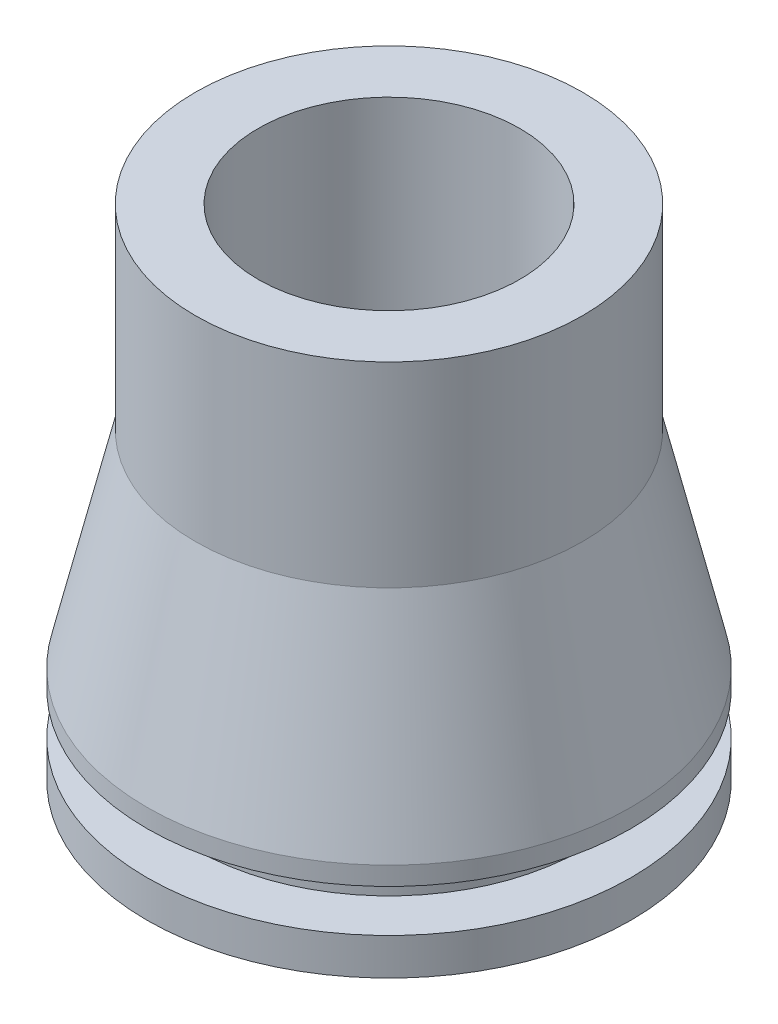
ISO-10303-21;
HEADER;
FILE_DESCRIPTION(('STEP AP214'),'2;1');
FILE_NAME('part.step','',(''),(''),'','','');
FILE_SCHEMA(('AUTOMOTIVE_DESIGN { 1 0 10303 214 1 1 1 1 }'));
ENDSEC;
DATA;
#1=APPLICATION_CONTEXT('core data for automotive mechanical design processes');
#2=APPLICATION_PROTOCOL_DEFINITION('international standard','automotive_design',2000,#1);
#3=PRODUCT_CONTEXT('',#1,'mechanical');
#4=PRODUCT('Part','Part','',(#3));
#5=PRODUCT_RELATED_PRODUCT_CATEGORY('part','',(#4));
#6=PRODUCT_DEFINITION_FORMATION('','',#4);
#7=PRODUCT_DEFINITION_CONTEXT('part definition',#1,'design');
#8=PRODUCT_DEFINITION('design','',#6,#7);
#9=PRODUCT_DEFINITION_SHAPE('','',#8);
#10=(LENGTH_UNIT() NAMED_UNIT(*) SI_UNIT(.MILLI.,.METRE.));
#11=(NAMED_UNIT(*) PLANE_ANGLE_UNIT() SI_UNIT($,.RADIAN.));
#12=(NAMED_UNIT(*) SI_UNIT($,.STERADIAN.) SOLID_ANGLE_UNIT());
#13=UNCERTAINTY_MEASURE_WITH_UNIT(LENGTH_MEASURE(1.E-05),#10,'distance_accuracy_value','');
#14=(GEOMETRIC_REPRESENTATION_CONTEXT(3) GLOBAL_UNCERTAINTY_ASSIGNED_CONTEXT((#13)) GLOBAL_UNIT_ASSIGNED_CONTEXT((#10,
#11,#12)) REPRESENTATION_CONTEXT('',''));
#15=CARTESIAN_POINT('',(0.,0.,0.));
#16=DIRECTION('',(0.,0.,1.));
#17=DIRECTION('',(1.,0.,0.));
#18=AXIS2_PLACEMENT_3D('',#15,#16,#17);
#19=CARTESIAN_POINT('',(6.66115,0.,0.));
#20=DIRECTION('',(0.,-1.,0.));
#21=DIRECTION('',(0.,0.,-1.));
#22=AXIS2_PLACEMENT_3D('',#19,#20,#21);
#23=PLANE('',#22);
#24=CARTESIAN_POINT('',(0.,0.,0.));
#25=DIRECTION('',(0.,-1.,0.));
#26=DIRECTION('',(0.,0.,-1.));
#27=AXIS2_PLACEMENT_3D('',#24,#25,#26);
#28=CIRCLE('',#27,6.66115);
#29=CARTESIAN_POINT('',(0.,0.,-6.66115));
#30=VERTEX_POINT('',#29);
#31=EDGE_CURVE('E64',#30,#30,#28,.T.);
#32=ORIENTED_EDGE('',*,*,#31,.T.);
#33=EDGE_LOOP('',(#32));
#34=FACE_BOUND('',#33,.T.);
#35=CARTESIAN_POINT('',(0.,0.,0.));
#36=DIRECTION('',(0.,-1.,0.));
#37=DIRECTION('',(0.,0.,-1.));
#38=AXIS2_PLACEMENT_3D('',#35,#36,#37);
#39=CIRCLE('',#38,3.60045);
#40=CARTESIAN_POINT('',(0.,0.,-3.60045));
#41=VERTEX_POINT('',#40);
#42=EDGE_CURVE('E10',#41,#41,#39,.T.);
#43=ORIENTED_EDGE('',*,*,#42,.F.);
#44=EDGE_LOOP('',(#43));
#45=FACE_BOUND('',#44,.T.);
#46=ADVANCED_FACE('F30',(#34,#45),#23,.T.);
#47=CARTESIAN_POINT('',(0.,0.,0.));
#48=DIRECTION('',(0.,-1.,0.));
#49=DIRECTION('',(0.,0.,-1.));
#50=AXIS2_PLACEMENT_3D('',#47,#48,#49);
#51=CYLINDRICAL_SURFACE('',#50,3.60045);
#52=ORIENTED_EDGE('',*,*,#42,.T.);
#53=EDGE_LOOP('',(#52));
#54=FACE_BOUND('',#53,.T.);
#55=CARTESIAN_POINT('',(0.,13.7414,0.));
#56=DIRECTION('',(0.,-1.,0.));
#57=DIRECTION('',(0.,0.,-1.));
#58=AXIS2_PLACEMENT_3D('',#55,#56,#57);
#59=CIRCLE('',#58,3.60045);
#60=CARTESIAN_POINT('',(0.,13.7414,-3.60045));
#61=VERTEX_POINT('',#60);
#62=EDGE_CURVE('E36',#61,#61,#59,.T.);
#63=ORIENTED_EDGE('',*,*,#62,.F.);
#64=EDGE_LOOP('',(#63));
#65=FACE_BOUND('',#64,.T.);
#66=ADVANCED_FACE('F82',(#54,#65),#51,.F.);
#67=CARTESIAN_POINT('',(3.60045,13.7414,0.));
#68=DIRECTION('',(0.,1.,0.));
#69=DIRECTION('',(0.,0.,1.));
#70=AXIS2_PLACEMENT_3D('',#67,#68,#69);
#71=PLANE('',#70);
#72=ORIENTED_EDGE('',*,*,#62,.T.);
#73=EDGE_LOOP('',(#72));
#74=FACE_BOUND('',#73,.T.);
#75=CARTESIAN_POINT('',(0.,13.7414,0.));
#76=DIRECTION('',(0.,-1.,0.));
#77=DIRECTION('',(0.,0.,-1.));
#78=AXIS2_PLACEMENT_3D('',#75,#76,#77);
#79=CIRCLE('',#78,5.32765);
#80=CARTESIAN_POINT('',(0.,13.7414,-5.32765));
#81=VERTEX_POINT('',#80);
#82=EDGE_CURVE('E40',#81,#81,#79,.T.);
#83=ORIENTED_EDGE('',*,*,#82,.F.);
#84=EDGE_LOOP('',(#83));
#85=FACE_BOUND('',#84,.T.);
#86=ADVANCED_FACE('F86',(#74,#85),#71,.T.);
#87=CARTESIAN_POINT('',(0.,0.,0.));
#88=DIRECTION('',(0.,-1.,0.));
#89=DIRECTION('',(0.,0.,-1.));
#90=AXIS2_PLACEMENT_3D('',#87,#88,#89);
#91=CYLINDRICAL_SURFACE('',#90,5.32765);
#92=ORIENTED_EDGE('',*,*,#82,.T.);
#93=EDGE_LOOP('',(#92));
#94=FACE_BOUND('',#93,.T.);
#95=CARTESIAN_POINT('',(0.,8.3566,0.));
#96=DIRECTION('',(0.,-1.,0.));
#97=DIRECTION('',(0.,0.,-1.));
#98=AXIS2_PLACEMENT_3D('',#95,#96,#97);
#99=CIRCLE('',#98,5.32765);
#100=CARTESIAN_POINT('',(0.,8.3566,-5.32765));
#101=VERTEX_POINT('',#100);
#102=EDGE_CURVE('E44',#101,#101,#99,.T.);
#103=ORIENTED_EDGE('',*,*,#102,.F.);
#104=EDGE_LOOP('',(#103));
#105=FACE_BOUND('',#104,.T.);
#106=ADVANCED_FACE('F90',(#94,#105),#91,.T.);
#107=CARTESIAN_POINT('',(0.,2.6924,0.));
#108=DIRECTION('',(0.,-1.,0.));
#109=DIRECTION('',(0.,0.,-1.));
#110=AXIS2_PLACEMENT_3D('',#107,#108,#109);
#111=CONICAL_SURFACE('',#110,6.66115,0.231215635953057);
#112=ORIENTED_EDGE('',*,*,#102,.T.);
#113=EDGE_LOOP('',(#112));
#114=FACE_BOUND('',#113,.T.);
#115=CARTESIAN_POINT('',(0.,2.6924,0.));
#116=DIRECTION('',(0.,-1.,0.));
#117=DIRECTION('',(0.,0.,-1.));
#118=AXIS2_PLACEMENT_3D('',#115,#116,#117);
#119=CIRCLE('',#118,6.66115);
#120=CARTESIAN_POINT('',(0.,2.6924,-6.66115));
#121=VERTEX_POINT('',#120);
#122=EDGE_CURVE('E49',#121,#121,#119,.T.);
#123=ORIENTED_EDGE('',*,*,#122,.F.);
#124=EDGE_LOOP('',(#123));
#125=FACE_BOUND('',#124,.T.);
#126=ADVANCED_FACE('F96',(#114,#125),#111,.T.);
#127=CARTESIAN_POINT('',(0.,0.,0.));
#128=DIRECTION('',(0.,-1.,0.));
#129=DIRECTION('',(0.,0.,-1.));
#130=AXIS2_PLACEMENT_3D('',#127,#128,#129);
#131=CYLINDRICAL_SURFACE('',#130,6.66115);
#132=ORIENTED_EDGE('',*,*,#122,.T.);
#133=EDGE_LOOP('',(#132));
#134=FACE_BOUND('',#133,.T.);
#135=CARTESIAN_POINT('',(0.,2.1844,0.));
#136=DIRECTION('',(0.,-1.,0.));
#137=DIRECTION('',(0.,0.,-1.));
#138=AXIS2_PLACEMENT_3D('',#135,#136,#137);
#139=CIRCLE('',#138,6.66115);
#140=CARTESIAN_POINT('',(0.,2.1844,-6.66115));
#141=VERTEX_POINT('',#140);
#142=EDGE_CURVE('E52',#141,#141,#139,.T.);
#143=ORIENTED_EDGE('',*,*,#142,.F.);
#144=EDGE_LOOP('',(#143));
#145=FACE_BOUND('',#144,.T.);
#146=ADVANCED_FACE('F100',(#134,#145),#131,.T.);
#147=CARTESIAN_POINT('',(6.66115,2.1844,0.));
#148=DIRECTION('',(0.,-1.,0.));
#149=DIRECTION('',(0.,0.,-1.));
#150=AXIS2_PLACEMENT_3D('',#147,#148,#149);
#151=PLANE('',#150);
#152=ORIENTED_EDGE('',*,*,#142,.T.);
#153=EDGE_LOOP('',(#152));
#154=FACE_BOUND('',#153,.T.);
#155=CARTESIAN_POINT('',(0.,2.1844,0.));
#156=DIRECTION('',(0.,-1.,0.));
#157=DIRECTION('',(0.,0.,-1.));
#158=AXIS2_PLACEMENT_3D('',#155,#156,#157);
#159=CIRCLE('',#158,5.32765);
#160=CARTESIAN_POINT('',(0.,2.1844,-5.32765));
#161=VERTEX_POINT('',#160);
#162=EDGE_CURVE('E55',#161,#161,#159,.T.);
#163=ORIENTED_EDGE('',*,*,#162,.F.);
#164=EDGE_LOOP('',(#163));
#165=FACE_BOUND('',#164,.T.);
#166=ADVANCED_FACE('F104',(#154,#165),#151,.T.);
#167=CARTESIAN_POINT('',(0.,0.,0.));
#168=DIRECTION('',(0.,-1.,0.));
#169=DIRECTION('',(0.,0.,-1.));
#170=AXIS2_PLACEMENT_3D('',#167,#168,#169);
#171=CYLINDRICAL_SURFACE('',#170,5.32765);
#172=ORIENTED_EDGE('',*,*,#162,.T.);
#173=EDGE_LOOP('',(#172));
#174=FACE_BOUND('',#173,.T.);
#175=CARTESIAN_POINT('',(0.,1.016,0.));
#176=DIRECTION('',(0.,-1.,0.));
#177=DIRECTION('',(0.,0.,-1.));
#178=AXIS2_PLACEMENT_3D('',#175,#176,#177);
#179=CIRCLE('',#178,5.32765);
#180=CARTESIAN_POINT('',(0.,1.016,-5.32765));
#181=VERTEX_POINT('',#180);
#182=EDGE_CURVE('E58',#181,#181,#179,.T.);
#183=ORIENTED_EDGE('',*,*,#182,.F.);
#184=EDGE_LOOP('',(#183));
#185=FACE_BOUND('',#184,.T.);
#186=ADVANCED_FACE('F78',(#174,#185),#171,.T.);
#187=CARTESIAN_POINT('',(5.32765,1.016,0.));
#188=DIRECTION('',(0.,1.,0.));
#189=DIRECTION('',(0.,0.,1.));
#190=AXIS2_PLACEMENT_3D('',#187,#188,#189);
#191=PLANE('',#190);
#192=ORIENTED_EDGE('',*,*,#182,.T.);
#193=EDGE_LOOP('',(#192));
#194=FACE_BOUND('',#193,.T.);
#195=CARTESIAN_POINT('',(0.,1.016,0.));
#196=DIRECTION('',(0.,-1.,0.));
#197=DIRECTION('',(0.,0.,-1.));
#198=AXIS2_PLACEMENT_3D('',#195,#196,#197);
#199=CIRCLE('',#198,6.66115);
#200=CARTESIAN_POINT('',(0.,1.016,-6.66115));
#201=VERTEX_POINT('',#200);
#202=EDGE_CURVE('E61',#201,#201,#199,.T.);
#203=ORIENTED_EDGE('',*,*,#202,.F.);
#204=EDGE_LOOP('',(#203));
#205=FACE_BOUND('',#204,.T.);
#206=ADVANCED_FACE('F72',(#194,#205),#191,.T.);
#207=CARTESIAN_POINT('',(0.,0.,0.));
#208=DIRECTION('',(0.,-1.,0.));
#209=DIRECTION('',(0.,0.,-1.));
#210=AXIS2_PLACEMENT_3D('',#207,#208,#209);
#211=CYLINDRICAL_SURFACE('',#210,6.66115);
#212=ORIENTED_EDGE('',*,*,#202,.T.);
#213=EDGE_LOOP('',(#212));
#214=FACE_BOUND('',#213,.T.);
#215=ORIENTED_EDGE('',*,*,#31,.F.);
#216=EDGE_LOOP('',(#215));
#217=FACE_BOUND('',#216,.T.);
#218=ADVANCED_FACE('F70',(#214,#217),#211,.T.);
#219=CLOSED_SHELL('',(#46,#66,#86,#106,#126,#146,#166,#186,#206,#218));
#220=MANIFOLD_SOLID_BREP('B2',#219);
#221=ADVANCED_BREP_SHAPE_REPRESENTATION('',(#18,#220),#14);
#222=SHAPE_DEFINITION_REPRESENTATION(#9,#221);
ENDSEC;
END-ISO-10303-21;
